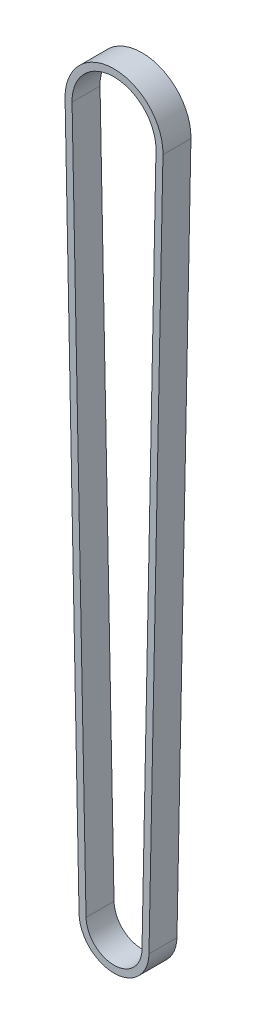
ISO-10303-21;
HEADER;
FILE_DESCRIPTION(('STEP AP214'),'2;1');
FILE_NAME('part.step','',(''),(''),'','','');
FILE_SCHEMA(('AUTOMOTIVE_DESIGN { 1 0 10303 214 1 1 1 1 }'));
ENDSEC;
DATA;
#1=APPLICATION_CONTEXT('core data for automotive mechanical design processes');
#2=APPLICATION_PROTOCOL_DEFINITION('international standard','automotive_design',2000,#1);
#3=PRODUCT_CONTEXT('',#1,'mechanical');
#4=PRODUCT('Part','Part','',(#3));
#5=PRODUCT_RELATED_PRODUCT_CATEGORY('part','',(#4));
#6=PRODUCT_DEFINITION_FORMATION('','',#4);
#7=PRODUCT_DEFINITION_CONTEXT('part definition',#1,'design');
#8=PRODUCT_DEFINITION('design','',#6,#7);
#9=PRODUCT_DEFINITION_SHAPE('','',#8);
#10=(LENGTH_UNIT() NAMED_UNIT(*) SI_UNIT(.MILLI.,.METRE.));
#11=(NAMED_UNIT(*) PLANE_ANGLE_UNIT() SI_UNIT($,.RADIAN.));
#12=(NAMED_UNIT(*) SI_UNIT($,.STERADIAN.) SOLID_ANGLE_UNIT());
#13=UNCERTAINTY_MEASURE_WITH_UNIT(LENGTH_MEASURE(1.E-05),#10,'distance_accuracy_value','');
#14=(GEOMETRIC_REPRESENTATION_CONTEXT(3) GLOBAL_UNCERTAINTY_ASSIGNED_CONTEXT((#13)) GLOBAL_UNIT_ASSIGNED_CONTEXT((#10,
#11,#12)) REPRESENTATION_CONTEXT('',''));
#15=CARTESIAN_POINT('',(0.,0.,0.));
#16=DIRECTION('',(0.,0.,1.));
#17=DIRECTION('',(1.,0.,0.));
#18=AXIS2_PLACEMENT_3D('',#15,#16,#17);
#19=CARTESIAN_POINT('',(0.,400.,16.));
#20=DIRECTION('',(0.,0.,1.));
#21=DIRECTION('',(1.,0.,0.));
#22=AXIS2_PLACEMENT_3D('',#19,#20,#21);
#23=PLANE('',#22);
#24=CARTESIAN_POINT('',(0.,400.,16.));
#25=DIRECTION('',(0.,0.,1.));
#26=DIRECTION('',(1.,0.,0.));
#27=AXIS2_PLACEMENT_3D('',#24,#25,#26);
#28=CIRCLE('',#27,28.);
#29=CARTESIAN_POINT('',(27.994399439888,399.44,16.));
#30=VERTEX_POINT('',#29);
#31=CARTESIAN_POINT('',(-27.994399439888,399.44,16.));
#32=VERTEX_POINT('',#31);
#33=EDGE_CURVE('E159',#30,#32,#28,.T.);
#34=ORIENTED_EDGE('',*,*,#33,.T.);
#35=DIRECTION('',(0.02,-0.999799979995999,0.));
#36=VECTOR('',#35,1.);
#37=CARTESIAN_POINT('',(-19.99599959992,-0.4,16.));
#38=LINE('',#37,#36);
#39=CARTESIAN_POINT('',(-19.99599959992,-0.399999999999996,16.));
#40=VERTEX_POINT('',#39);
#41=EDGE_CURVE('E163',#32,#40,#38,.T.);
#42=ORIENTED_EDGE('',*,*,#41,.T.);
#43=CARTESIAN_POINT('',(0.,0.,16.));
#44=DIRECTION('',(0.,0.,1.));
#45=DIRECTION('',(1.,0.,0.));
#46=AXIS2_PLACEMENT_3D('',#43,#44,#45);
#47=CIRCLE('',#46,20.);
#48=CARTESIAN_POINT('',(19.99599959992,-0.400000000000012,16.));
#49=VERTEX_POINT('',#48);
#50=EDGE_CURVE('E167',#40,#49,#47,.T.);
#51=ORIENTED_EDGE('',*,*,#50,.T.);
#52=DIRECTION('',(0.02,0.999799979995999,0.));
#53=VECTOR('',#52,1.);
#54=CARTESIAN_POINT('',(27.994399439888,399.44,16.));
#55=LINE('',#54,#53);
#56=EDGE_CURVE('E170',#49,#30,#55,.T.);
#57=ORIENTED_EDGE('',*,*,#56,.T.);
#58=EDGE_LOOP('',(#34,#42,#51,#57));
#59=FACE_BOUND('',#58,.T.);
#60=DIRECTION('',(0.02,0.999799979995999,0.));
#61=VECTOR('',#60,1.);
#62=CARTESIAN_POINT('',(23.995199519904,399.52,16.));
#63=LINE('',#62,#61);
#64=CARTESIAN_POINT('',(15.996799679936,-0.32,16.));
#65=VERTEX_POINT('',#64);
#66=CARTESIAN_POINT('',(23.995199519904,399.52,16.));
#67=VERTEX_POINT('',#66);
#68=EDGE_CURVE('E120',#65,#67,#63,.T.);
#69=ORIENTED_EDGE('',*,*,#68,.F.);
#70=CARTESIAN_POINT('',(0.,0.,16.));
#71=DIRECTION('',(0.,0.,1.));
#72=DIRECTION('',(1.,0.,0.));
#73=AXIS2_PLACEMENT_3D('',#70,#71,#72);
#74=CIRCLE('',#73,16.);
#75=CARTESIAN_POINT('',(-15.996799679936,-0.32,16.));
#76=VERTEX_POINT('',#75);
#77=EDGE_CURVE('E111',#76,#65,#74,.T.);
#78=ORIENTED_EDGE('',*,*,#77,.F.);
#79=DIRECTION('',(0.02,-0.999799979995999,0.));
#80=VECTOR('',#79,1.);
#81=CARTESIAN_POINT('',(-15.996799679936,-0.32,16.));
#82=LINE('',#81,#80);
#83=CARTESIAN_POINT('',(-23.995199519904,399.52,16.));
#84=VERTEX_POINT('',#83);
#85=EDGE_CURVE('E137',#84,#76,#82,.T.);
#86=ORIENTED_EDGE('',*,*,#85,.F.);
#87=CARTESIAN_POINT('',(0.,400.,16.));
#88=DIRECTION('',(0.,0.,1.));
#89=DIRECTION('',(1.,0.,0.));
#90=AXIS2_PLACEMENT_3D('',#87,#88,#89);
#91=CIRCLE('',#90,24.);
#92=EDGE_CURVE('E133',#67,#84,#91,.T.);
#93=ORIENTED_EDGE('',*,*,#92,.F.);
#94=EDGE_LOOP('',(#69,#78,#86,#93));
#95=FACE_BOUND('',#94,.T.);
#96=ADVANCED_FACE('F45',(#59,#95),#23,.T.);
#97=CARTESIAN_POINT('',(0.,400.,0.));
#98=DIRECTION('',(0.,0.,1.));
#99=DIRECTION('',(1.,0.,0.));
#100=AXIS2_PLACEMENT_3D('',#97,#98,#99);
#101=PLANE('',#100);
#102=CARTESIAN_POINT('',(0.,400.,0.));
#103=DIRECTION('',(0.,0.,1.));
#104=DIRECTION('',(1.,0.,0.));
#105=AXIS2_PLACEMENT_3D('',#102,#103,#104);
#106=CIRCLE('',#105,28.);
#107=CARTESIAN_POINT('',(27.994399439888,399.44,0.));
#108=VERTEX_POINT('',#107);
#109=CARTESIAN_POINT('',(-27.994399439888,399.44,0.));
#110=VERTEX_POINT('',#109);
#111=EDGE_CURVE('E129',#108,#110,#106,.T.);
#112=ORIENTED_EDGE('',*,*,#111,.F.);
#113=DIRECTION('',(0.02,0.999799979995999,0.));
#114=VECTOR('',#113,1.);
#115=CARTESIAN_POINT('',(27.994399439888,399.44,0.));
#116=LINE('',#115,#114);
#117=CARTESIAN_POINT('',(19.99599959992,-0.400000000000012,0.));
#118=VERTEX_POINT('',#117);
#119=EDGE_CURVE('E164',#118,#108,#116,.T.);
#120=ORIENTED_EDGE('',*,*,#119,.F.);
#121=CARTESIAN_POINT('',(0.,0.,0.));
#122=DIRECTION('',(0.,0.,1.));
#123=DIRECTION('',(1.,0.,0.));
#124=AXIS2_PLACEMENT_3D('',#121,#122,#123);
#125=CIRCLE('',#124,20.);
#126=CARTESIAN_POINT('',(-19.99599959992,-0.399999999999996,0.));
#127=VERTEX_POINT('',#126);
#128=EDGE_CURVE('E180',#127,#118,#125,.T.);
#129=ORIENTED_EDGE('',*,*,#128,.F.);
#130=DIRECTION('',(0.02,-0.999799979995999,0.));
#131=VECTOR('',#130,1.);
#132=CARTESIAN_POINT('',(-19.99599959992,-0.4,0.));
#133=LINE('',#132,#131);
#134=EDGE_CURVE('E177',#110,#127,#133,.T.);
#135=ORIENTED_EDGE('',*,*,#134,.F.);
#136=EDGE_LOOP('',(#112,#120,#129,#135));
#137=FACE_BOUND('',#136,.T.);
#138=CARTESIAN_POINT('',(0.,0.,0.));
#139=DIRECTION('',(0.,0.,1.));
#140=DIRECTION('',(1.,0.,0.));
#141=AXIS2_PLACEMENT_3D('',#138,#139,#140);
#142=CIRCLE('',#141,16.);
#143=CARTESIAN_POINT('',(-15.996799679936,-0.319999999999987,0.));
#144=VERTEX_POINT('',#143);
#145=CARTESIAN_POINT('',(15.996799679936,-0.32,0.));
#146=VERTEX_POINT('',#145);
#147=EDGE_CURVE('E69',#144,#146,#142,.T.);
#148=ORIENTED_EDGE('',*,*,#147,.T.);
#149=DIRECTION('',(0.02,0.999799979995999,0.));
#150=VECTOR('',#149,1.);
#151=CARTESIAN_POINT('',(23.995199519904,399.52,0.));
#152=LINE('',#151,#150);
#153=CARTESIAN_POINT('',(23.995199519904,399.52,0.));
#154=VERTEX_POINT('',#153);
#155=EDGE_CURVE('E127',#146,#154,#152,.T.);
#156=ORIENTED_EDGE('',*,*,#155,.T.);
#157=CARTESIAN_POINT('',(0.,400.,0.));
#158=DIRECTION('',(0.,0.,1.));
#159=DIRECTION('',(1.,0.,0.));
#160=AXIS2_PLACEMENT_3D('',#157,#158,#159);
#161=CIRCLE('',#160,24.);
#162=CARTESIAN_POINT('',(-23.995199519904,399.52,0.));
#163=VERTEX_POINT('',#162);
#164=EDGE_CURVE('E146',#154,#163,#161,.T.);
#165=ORIENTED_EDGE('',*,*,#164,.T.);
#166=DIRECTION('',(0.02,-0.999799979995999,0.));
#167=VECTOR('',#166,1.);
#168=CARTESIAN_POINT('',(-15.996799679936,-0.32,0.));
#169=LINE('',#168,#167);
#170=EDGE_CURVE('E121',#163,#144,#169,.T.);
#171=ORIENTED_EDGE('',*,*,#170,.T.);
#172=EDGE_LOOP('',(#148,#156,#165,#171));
#173=FACE_BOUND('',#172,.T.);
#174=ADVANCED_FACE('F203',(#137,#173),#101,.F.);
#175=CARTESIAN_POINT('',(0.,400.,16.));
#176=DIRECTION('',(0.,0.,-1.));
#177=DIRECTION('',(-1.,0.,0.));
#178=AXIS2_PLACEMENT_3D('',#175,#176,#177);
#179=CYLINDRICAL_SURFACE('',#178,28.);
#180=ORIENTED_EDGE('',*,*,#111,.T.);
#181=DIRECTION('',(0.,0.,-1.));
#182=VECTOR('',#181,1.);
#183=CARTESIAN_POINT('',(-27.994399439888,399.44,16.));
#184=LINE('',#183,#182);
#185=EDGE_CURVE('E11',#32,#110,#184,.T.);
#186=ORIENTED_EDGE('',*,*,#185,.F.);
#187=ORIENTED_EDGE('',*,*,#33,.F.);
#188=DIRECTION('',(0.,0.,-1.));
#189=VECTOR('',#188,1.);
#190=CARTESIAN_POINT('',(27.994399439888,399.44,16.));
#191=LINE('',#190,#189);
#192=EDGE_CURVE('E173',#30,#108,#191,.T.);
#193=ORIENTED_EDGE('',*,*,#192,.T.);
#194=EDGE_LOOP('',(#180,#186,#187,#193));
#195=FACE_BOUND('',#194,.T.);
#196=ADVANCED_FACE('F47',(#195),#179,.T.);
#197=CARTESIAN_POINT('',(-19.99599959992,-0.4,16.));
#198=DIRECTION('',(0.999799979995999,0.02,0.));
#199=DIRECTION('',(-0.02,0.999799979995999,0.));
#200=AXIS2_PLACEMENT_3D('',#197,#198,#199);
#201=PLANE('',#200);
#202=ORIENTED_EDGE('',*,*,#134,.T.);
#203=DIRECTION('',(0.,0.,-1.));
#204=VECTOR('',#203,1.);
#205=CARTESIAN_POINT('',(-19.99599959992,-0.399999999999996,16.));
#206=LINE('',#205,#204);
#207=EDGE_CURVE('E54',#40,#127,#206,.T.);
#208=ORIENTED_EDGE('',*,*,#207,.F.);
#209=ORIENTED_EDGE('',*,*,#41,.F.);
#210=ORIENTED_EDGE('',*,*,#185,.T.);
#211=EDGE_LOOP('',(#202,#208,#209,#210));
#212=FACE_BOUND('',#211,.T.);
#213=ADVANCED_FACE('F213',(#212),#201,.F.);
#214=CARTESIAN_POINT('',(0.,0.,16.));
#215=DIRECTION('',(0.,0.,-1.));
#216=DIRECTION('',(-1.,0.,0.));
#217=AXIS2_PLACEMENT_3D('',#214,#215,#216);
#218=CYLINDRICAL_SURFACE('',#217,20.);
#219=ORIENTED_EDGE('',*,*,#128,.T.);
#220=DIRECTION('',(0.,0.,-1.));
#221=VECTOR('',#220,1.);
#222=CARTESIAN_POINT('',(19.99599959992,-0.400000000000012,16.));
#223=LINE('',#222,#221);
#224=EDGE_CURVE('E188',#49,#118,#223,.T.);
#225=ORIENTED_EDGE('',*,*,#224,.F.);
#226=ORIENTED_EDGE('',*,*,#50,.F.);
#227=ORIENTED_EDGE('',*,*,#207,.T.);
#228=EDGE_LOOP('',(#219,#225,#226,#227));
#229=FACE_BOUND('',#228,.T.);
#230=ADVANCED_FACE('F197',(#229),#218,.T.);
#231=CARTESIAN_POINT('',(27.994399439888,399.44,16.));
#232=DIRECTION('',(-0.999799979995999,0.02,0.));
#233=DIRECTION('',(-0.02,-0.999799979995999,0.));
#234=AXIS2_PLACEMENT_3D('',#231,#232,#233);
#235=PLANE('',#234);
#236=ORIENTED_EDGE('',*,*,#119,.T.);
#237=ORIENTED_EDGE('',*,*,#192,.F.);
#238=ORIENTED_EDGE('',*,*,#56,.F.);
#239=ORIENTED_EDGE('',*,*,#224,.T.);
#240=EDGE_LOOP('',(#236,#237,#238,#239));
#241=FACE_BOUND('',#240,.T.);
#242=ADVANCED_FACE('F207',(#241),#235,.F.);
#243=CARTESIAN_POINT('',(0.,0.,16.));
#244=DIRECTION('',(0.,0.,-1.));
#245=DIRECTION('',(-1.,0.,0.));
#246=AXIS2_PLACEMENT_3D('',#243,#244,#245);
#247=CYLINDRICAL_SURFACE('',#246,16.);
#248=ORIENTED_EDGE('',*,*,#147,.F.);
#249=DIRECTION('',(0.,0.,-1.));
#250=VECTOR('',#249,1.);
#251=CARTESIAN_POINT('',(-15.996799679936,-0.32,16.));
#252=LINE('',#251,#250);
#253=EDGE_CURVE('E115',#76,#144,#252,.T.);
#254=ORIENTED_EDGE('',*,*,#253,.F.);
#255=ORIENTED_EDGE('',*,*,#77,.T.);
#256=DIRECTION('',(0.,0.,-1.));
#257=VECTOR('',#256,1.);
#258=CARTESIAN_POINT('',(15.996799679936,-0.32,16.));
#259=LINE('',#258,#257);
#260=EDGE_CURVE('E114',#65,#146,#259,.T.);
#261=ORIENTED_EDGE('',*,*,#260,.T.);
#262=EDGE_LOOP('',(#248,#254,#255,#261));
#263=FACE_BOUND('',#262,.T.);
#264=ADVANCED_FACE('F113',(#263),#247,.F.);
#265=CARTESIAN_POINT('',(23.995199519904,399.52,16.));
#266=DIRECTION('',(-0.999799979995999,0.02,0.));
#267=DIRECTION('',(-0.02,-0.999799979995999,0.));
#268=AXIS2_PLACEMENT_3D('',#265,#266,#267);
#269=PLANE('',#268);
#270=ORIENTED_EDGE('',*,*,#155,.F.);
#271=ORIENTED_EDGE('',*,*,#260,.F.);
#272=ORIENTED_EDGE('',*,*,#68,.T.);
#273=DIRECTION('',(0.,0.,-1.));
#274=VECTOR('',#273,1.);
#275=CARTESIAN_POINT('',(23.995199519904,399.52,16.));
#276=LINE('',#275,#274);
#277=EDGE_CURVE('E130',#67,#154,#276,.T.);
#278=ORIENTED_EDGE('',*,*,#277,.T.);
#279=EDGE_LOOP('',(#270,#271,#272,#278));
#280=FACE_BOUND('',#279,.T.);
#281=ADVANCED_FACE('F124',(#280),#269,.T.);
#282=CARTESIAN_POINT('',(0.,400.,16.));
#283=DIRECTION('',(0.,0.,-1.));
#284=DIRECTION('',(-1.,0.,0.));
#285=AXIS2_PLACEMENT_3D('',#282,#283,#284);
#286=CYLINDRICAL_SURFACE('',#285,24.);
#287=ORIENTED_EDGE('',*,*,#164,.F.);
#288=ORIENTED_EDGE('',*,*,#277,.F.);
#289=ORIENTED_EDGE('',*,*,#92,.T.);
#290=DIRECTION('',(0.,0.,-1.));
#291=VECTOR('',#290,1.);
#292=CARTESIAN_POINT('',(-23.995199519904,399.52,16.));
#293=LINE('',#292,#291);
#294=EDGE_CURVE('E61',#84,#163,#293,.T.);
#295=ORIENTED_EDGE('',*,*,#294,.T.);
#296=EDGE_LOOP('',(#287,#288,#289,#295));
#297=FACE_BOUND('',#296,.T.);
#298=ADVANCED_FACE('F236',(#297),#286,.F.);
#299=CARTESIAN_POINT('',(-15.996799679936,-0.32,16.));
#300=DIRECTION('',(0.999799979995999,0.02,0.));
#301=DIRECTION('',(-0.02,0.999799979995999,0.));
#302=AXIS2_PLACEMENT_3D('',#299,#300,#301);
#303=PLANE('',#302);
#304=ORIENTED_EDGE('',*,*,#170,.F.);
#305=ORIENTED_EDGE('',*,*,#294,.F.);
#306=ORIENTED_EDGE('',*,*,#85,.T.);
#307=ORIENTED_EDGE('',*,*,#253,.T.);
#308=EDGE_LOOP('',(#304,#305,#306,#307));
#309=FACE_BOUND('',#308,.T.);
#310=ADVANCED_FACE('F240',(#309),#303,.T.);
#311=CLOSED_SHELL('',(#96,#174,#196,#213,#230,#242,#264,#281,#298,#310));
#312=MANIFOLD_SOLID_BREP('B2',#311);
#313=ADVANCED_BREP_SHAPE_REPRESENTATION('',(#18,#312),#14);
#314=SHAPE_DEFINITION_REPRESENTATION(#9,#313);
ENDSEC;
END-ISO-10303-21;
